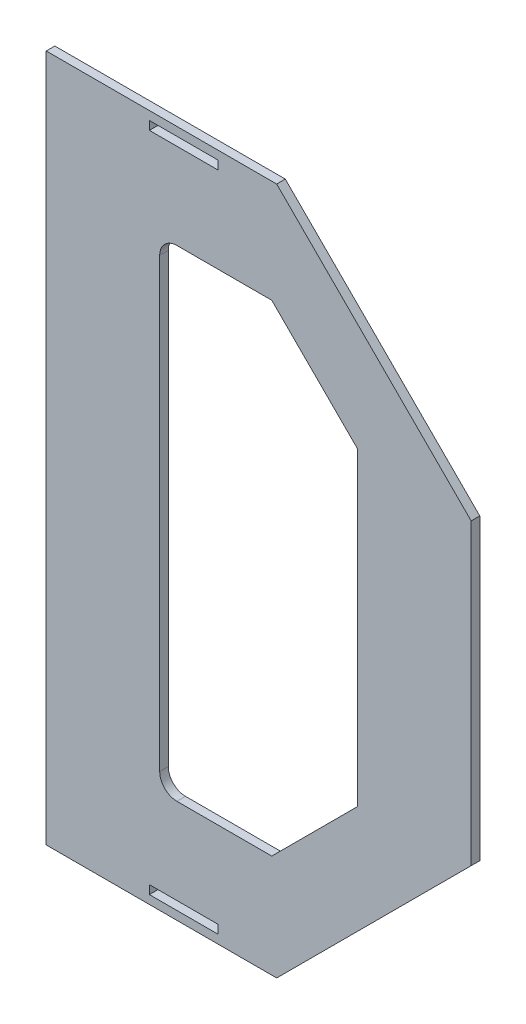
ISO-10303-21;
HEADER;
FILE_DESCRIPTION(('STEP AP214'),'2;1');
FILE_NAME('part.step','',(''),(''),'','','');
FILE_SCHEMA(('AUTOMOTIVE_DESIGN { 1 0 10303 214 1 1 1 1 }'));
ENDSEC;
DATA;
#1=APPLICATION_CONTEXT('core data for automotive mechanical design processes');
#2=APPLICATION_PROTOCOL_DEFINITION('international standard','automotive_design',2000,#1);
#3=PRODUCT_CONTEXT('',#1,'mechanical');
#4=PRODUCT('Part','Part','',(#3));
#5=PRODUCT_RELATED_PRODUCT_CATEGORY('part','',(#4));
#6=PRODUCT_DEFINITION_FORMATION('','',#4);
#7=PRODUCT_DEFINITION_CONTEXT('part definition',#1,'design');
#8=PRODUCT_DEFINITION('design','',#6,#7);
#9=PRODUCT_DEFINITION_SHAPE('','',#8);
#10=(LENGTH_UNIT() NAMED_UNIT(*) SI_UNIT(.MILLI.,.METRE.));
#11=(NAMED_UNIT(*) PLANE_ANGLE_UNIT() SI_UNIT($,.RADIAN.));
#12=(NAMED_UNIT(*) SI_UNIT($,.STERADIAN.) SOLID_ANGLE_UNIT());
#13=UNCERTAINTY_MEASURE_WITH_UNIT(LENGTH_MEASURE(1.E-05),#10,'distance_accuracy_value','');
#14=(GEOMETRIC_REPRESENTATION_CONTEXT(3) GLOBAL_UNCERTAINTY_ASSIGNED_CONTEXT((#13)) GLOBAL_UNIT_ASSIGNED_CONTEXT((#10,
#11,#12)) REPRESENTATION_CONTEXT('',''));
#15=CARTESIAN_POINT('',(0.,0.,0.));
#16=DIRECTION('',(0.,0.,1.));
#17=DIRECTION('',(1.,0.,0.));
#18=AXIS2_PLACEMENT_3D('',#15,#16,#17);
#19=CARTESIAN_POINT('',(0.,0.,-1.5875));
#20=DIRECTION('',(0.,0.,1.));
#21=DIRECTION('',(1.,0.,0.));
#22=AXIS2_PLACEMENT_3D('',#19,#20,#21);
#23=PLANE('',#22);
#24=DIRECTION('',(0.,-1.,0.));
#25=VECTOR('',#24,1.);
#26=CARTESIAN_POINT('',(-36.576,-82.55,-1.5875));
#27=LINE('',#26,#25);
#28=CARTESIAN_POINT('',(-36.576,82.55,-1.5875));
#29=VERTEX_POINT('',#28);
#30=CARTESIAN_POINT('',(-36.576,-82.55,-1.5875));
#31=VERTEX_POINT('',#30);
#32=EDGE_CURVE('E211',#29,#31,#27,.T.);
#33=ORIENTED_EDGE('',*,*,#32,.T.);
#34=CARTESIAN_POINT('',(-30.226,-82.55,-1.5875));
#35=DIRECTION('',(0.,0.,1.));
#36=DIRECTION('',(-1.,0.,0.));
#37=AXIS2_PLACEMENT_3D('',#34,#35,#36);
#38=CIRCLE('',#37,6.34999999999997);
#39=CARTESIAN_POINT('',(-30.226,-88.9,-1.5875));
#40=VERTEX_POINT('',#39);
#41=EDGE_CURVE('E205',#31,#40,#38,.T.);
#42=ORIENTED_EDGE('',*,*,#41,.T.);
#43=DIRECTION('',(1.,0.,0.));
#44=VECTOR('',#43,1.);
#45=CARTESIAN_POINT('',(-30.226,-88.9,-1.5875));
#46=LINE('',#45,#44);
#47=CARTESIAN_POINT('',(4.82599999999996,-88.9,-1.5875));
#48=VERTEX_POINT('',#47);
#49=EDGE_CURVE('E214',#40,#48,#46,.T.);
#50=ORIENTED_EDGE('',*,*,#49,.T.);
#51=DIRECTION('',(0.707106781186548,0.707106781186547,0.));
#52=VECTOR('',#51,1.);
#53=CARTESIAN_POINT('',(4.82599999999996,-88.9,-1.5875));
#54=LINE('',#53,#52);
#55=CARTESIAN_POINT('',(36.576,-57.15,-1.5875));
#56=VERTEX_POINT('',#55);
#57=EDGE_CURVE('E52',#48,#56,#54,.T.);
#58=ORIENTED_EDGE('',*,*,#57,.T.);
#59=DIRECTION('',(0.,1.,0.));
#60=VECTOR('',#59,1.);
#61=CARTESIAN_POINT('',(36.576,-57.15,-1.5875));
#62=LINE('',#61,#60);
#63=CARTESIAN_POINT('',(36.576,57.15,-1.5875));
#64=VERTEX_POINT('',#63);
#65=EDGE_CURVE('E228',#56,#64,#62,.T.);
#66=ORIENTED_EDGE('',*,*,#65,.T.);
#67=DIRECTION('',(-0.707106781186548,0.707106781186547,0.));
#68=VECTOR('',#67,1.);
#69=CARTESIAN_POINT('',(4.82599999999994,88.9,-1.5875));
#70=LINE('',#69,#68);
#71=CARTESIAN_POINT('',(4.82599999999994,88.9,-1.5875));
#72=VERTEX_POINT('',#71);
#73=EDGE_CURVE('E231',#64,#72,#70,.T.);
#74=ORIENTED_EDGE('',*,*,#73,.T.);
#75=DIRECTION('',(-1.,0.,0.));
#76=VECTOR('',#75,1.);
#77=CARTESIAN_POINT('',(-30.226,88.8999999999999,-1.5875));
#78=LINE('',#77,#76);
#79=CARTESIAN_POINT('',(-30.226,88.8999999999999,-1.5875));
#80=VERTEX_POINT('',#79);
#81=EDGE_CURVE('E234',#72,#80,#78,.T.);
#82=ORIENTED_EDGE('',*,*,#81,.T.);
#83=CARTESIAN_POINT('',(-30.226,82.55,-1.5875));
#84=DIRECTION('',(0.,0.,1.));
#85=DIRECTION('',(-1.,0.,0.));
#86=AXIS2_PLACEMENT_3D('',#83,#84,#85);
#87=CIRCLE('',#86,6.34999999999997);
#88=EDGE_CURVE('E237',#80,#29,#87,.T.);
#89=ORIENTED_EDGE('',*,*,#88,.T.);
#90=EDGE_LOOP('',(#33,#42,#50,#58,#66,#74,#82,#89));
#91=FACE_BOUND('',#90,.T.);
#92=DIRECTION('',(1.,0.,0.));
#93=VECTOR('',#92,1.);
#94=CARTESIAN_POINT('',(-40.386,-123.825,-1.5875));
#95=LINE('',#94,#93);
#96=CARTESIAN_POINT('',(-40.386,-123.825,-1.5875));
#97=VERTEX_POINT('',#96);
#98=CARTESIAN_POINT('',(-14.986,-123.825,-1.5875));
#99=VERTEX_POINT('',#98);
#100=EDGE_CURVE('E259',#97,#99,#95,.T.);
#101=ORIENTED_EDGE('',*,*,#100,.T.);
#102=DIRECTION('',(0.,1.,0.));
#103=VECTOR('',#102,1.);
#104=CARTESIAN_POINT('',(-14.986,-123.825,-1.5875));
#105=LINE('',#104,#103);
#106=CARTESIAN_POINT('',(-14.986,-120.65,-1.5875));
#107=VERTEX_POINT('',#106);
#108=EDGE_CURVE('E284',#99,#107,#105,.T.);
#109=ORIENTED_EDGE('',*,*,#108,.T.);
#110=DIRECTION('',(-1.,0.,0.));
#111=VECTOR('',#110,1.);
#112=CARTESIAN_POINT('',(-40.386,-120.65,-1.5875));
#113=LINE('',#112,#111);
#114=CARTESIAN_POINT('',(-40.386,-120.65,-1.5875));
#115=VERTEX_POINT('',#114);
#116=EDGE_CURVE('E287',#107,#115,#113,.T.);
#117=ORIENTED_EDGE('',*,*,#116,.T.);
#118=DIRECTION('',(0.,-1.,0.));
#119=VECTOR('',#118,1.);
#120=CARTESIAN_POINT('',(-40.386,-123.825,-1.5875));
#121=LINE('',#120,#119);
#122=EDGE_CURVE('E274',#115,#97,#121,.T.);
#123=ORIENTED_EDGE('',*,*,#122,.T.);
#124=EDGE_LOOP('',(#101,#109,#117,#123));
#125=FACE_BOUND('',#124,.T.);
#126=DIRECTION('',(0.,1.,0.));
#127=VECTOR('',#126,1.);
#128=CARTESIAN_POINT('',(-14.986,123.825,-1.5875));
#129=LINE('',#128,#127);
#130=CARTESIAN_POINT('',(-14.986,120.65,-1.5875));
#131=VERTEX_POINT('',#130);
#132=CARTESIAN_POINT('',(-14.986,123.825,-1.5875));
#133=VERTEX_POINT('',#132);
#134=EDGE_CURVE('E301',#131,#133,#129,.T.);
#135=ORIENTED_EDGE('',*,*,#134,.T.);
#136=DIRECTION('',(-1.,0.,0.));
#137=VECTOR('',#136,1.);
#138=CARTESIAN_POINT('',(-40.386,123.825,-1.5875));
#139=LINE('',#138,#137);
#140=CARTESIAN_POINT('',(-40.386,123.825,-1.5875));
#141=VERTEX_POINT('',#140);
#142=EDGE_CURVE('E315',#133,#141,#139,.T.);
#143=ORIENTED_EDGE('',*,*,#142,.T.);
#144=DIRECTION('',(0.,-1.,0.));
#145=VECTOR('',#144,1.);
#146=CARTESIAN_POINT('',(-40.386,123.825,-1.5875));
#147=LINE('',#146,#145);
#148=CARTESIAN_POINT('',(-40.386,120.65,-1.5875));
#149=VERTEX_POINT('',#148);
#150=EDGE_CURVE('E318',#141,#149,#147,.T.);
#151=ORIENTED_EDGE('',*,*,#150,.T.);
#152=DIRECTION('',(1.,0.,0.));
#153=VECTOR('',#152,1.);
#154=CARTESIAN_POINT('',(-40.386,120.65,-1.5875));
#155=LINE('',#154,#153);
#156=EDGE_CURVE('E305',#149,#131,#155,.T.);
#157=ORIENTED_EDGE('',*,*,#156,.T.);
#158=EDGE_LOOP('',(#135,#143,#151,#157));
#159=FACE_BOUND('',#158,.T.);
#160=DIRECTION('',(0.,-1.,0.));
#161=VECTOR('',#160,1.);
#162=CARTESIAN_POINT('',(-51.816,0.,-1.5875));
#163=LINE('',#162,#161);
#164=CARTESIAN_POINT('',(-51.816,127.,-1.5875));
#165=VERTEX_POINT('',#164);
#166=CARTESIAN_POINT('',(-51.816,-127.,-1.5875));
#167=VERTEX_POINT('',#166);
#168=EDGE_CURVE('E11',#165,#167,#163,.T.);
#169=ORIENTED_EDGE('',*,*,#168,.F.);
#170=DIRECTION('',(-1.,0.,0.));
#171=VECTOR('',#170,1.);
#172=CARTESIAN_POINT('',(-78.486,127.,-1.5875));
#173=LINE('',#172,#171);
#174=CARTESIAN_POINT('',(6.64395103144692,127.,-1.5875));
#175=VERTEX_POINT('',#174);
#176=EDGE_CURVE('E337',#175,#165,#173,.T.);
#177=ORIENTED_EDGE('',*,*,#176,.F.);
#178=DIRECTION('',(-0.707106781186546,0.707106781186549,0.));
#179=VECTOR('',#178,1.);
#180=CARTESIAN_POINT('',(6.64395103144692,127.,-1.5875));
#181=LINE('',#180,#179);
#182=CARTESIAN_POINT('',(65.786,67.8579510314466,-1.5875));
#183=VERTEX_POINT('',#182);
#184=EDGE_CURVE('E361',#183,#175,#181,.T.);
#185=ORIENTED_EDGE('',*,*,#184,.F.);
#186=DIRECTION('',(0.,1.,0.));
#187=VECTOR('',#186,1.);
#188=CARTESIAN_POINT('',(65.786,0.,-1.5875));
#189=LINE('',#188,#187);
#190=CARTESIAN_POINT('',(65.786,-67.8579510314466,-1.5875));
#191=VERTEX_POINT('',#190);
#192=EDGE_CURVE('E386',#191,#183,#189,.T.);
#193=ORIENTED_EDGE('',*,*,#192,.F.);
#194=DIRECTION('',(0.707106781186546,0.707106781186549,0.));
#195=VECTOR('',#194,1.);
#196=CARTESIAN_POINT('',(6.64395103144692,-127.,-1.5875));
#197=LINE('',#196,#195);
#198=CARTESIAN_POINT('',(6.64395103144692,-127.,-1.5875));
#199=VERTEX_POINT('',#198);
#200=EDGE_CURVE('E356',#199,#191,#197,.T.);
#201=ORIENTED_EDGE('',*,*,#200,.F.);
#202=DIRECTION('',(1.,0.,0.));
#203=VECTOR('',#202,1.);
#204=CARTESIAN_POINT('',(-78.486,-127.,-1.5875));
#205=LINE('',#204,#203);
#206=EDGE_CURVE('E350',#167,#199,#205,.T.);
#207=ORIENTED_EDGE('',*,*,#206,.F.);
#208=EDGE_LOOP('',(#169,#177,#185,#193,#201,#207));
#209=FACE_BOUND('',#208,.T.);
#210=ADVANCED_FACE('F36',(#91,#125,#159,#209),#23,.F.);
#211=CARTESIAN_POINT('',(-64.516,127.,-1.5875));
#212=VERTEX_POINT('',#211);
#213=EDGE_CURVE('E368',#165,#212,#173,.T.);
#214=ORIENTED_EDGE('',*,*,#213,.F.);
#215=ORIENTED_EDGE('',*,*,#168,.T.);
#216=CARTESIAN_POINT('',(-64.516,-127.,-1.5875));
#217=VERTEX_POINT('',#216);
#218=EDGE_CURVE('E355',#217,#167,#205,.T.);
#219=ORIENTED_EDGE('',*,*,#218,.F.);
#220=DIRECTION('',(0.,-1.,0.));
#221=VECTOR('',#220,1.);
#222=CARTESIAN_POINT('',(-64.516,0.,-1.5875));
#223=LINE('',#222,#221);
#224=EDGE_CURVE('E45',#212,#217,#223,.T.);
#225=ORIENTED_EDGE('',*,*,#224,.F.);
#226=EDGE_LOOP('',(#214,#215,#219,#225));
#227=FACE_BOUND('',#226,.T.);
#228=ADVANCED_FACE('F400',(#227),#23,.F.);
#229=CARTESIAN_POINT('',(-78.486,127.,-1.5875));
#230=VERTEX_POINT('',#229);
#231=EDGE_CURVE('E365',#212,#230,#173,.T.);
#232=ORIENTED_EDGE('',*,*,#231,.F.);
#233=ORIENTED_EDGE('',*,*,#224,.T.);
#234=CARTESIAN_POINT('',(-78.486,-127.,-1.5875));
#235=VERTEX_POINT('',#234);
#236=EDGE_CURVE('E351',#235,#217,#205,.T.);
#237=ORIENTED_EDGE('',*,*,#236,.F.);
#238=DIRECTION('',(0.,-1.,0.));
#239=VECTOR('',#238,1.);
#240=CARTESIAN_POINT('',(-78.486,127.,-1.5875));
#241=LINE('',#240,#239);
#242=EDGE_CURVE('E332',#230,#235,#241,.T.);
#243=ORIENTED_EDGE('',*,*,#242,.F.);
#244=EDGE_LOOP('',(#232,#233,#237,#243));
#245=FACE_BOUND('',#244,.T.);
#246=ADVANCED_FACE('F395',(#245),#23,.F.);
#247=CARTESIAN_POINT('',(0.,0.,1.5875));
#248=DIRECTION('',(0.,0.,1.));
#249=DIRECTION('',(1.,0.,0.));
#250=AXIS2_PLACEMENT_3D('',#247,#248,#249);
#251=PLANE('',#250);
#252=CARTESIAN_POINT('',(-30.226,-82.55,1.5875));
#253=DIRECTION('',(0.,0.,1.));
#254=DIRECTION('',(-1.,0.,0.));
#255=AXIS2_PLACEMENT_3D('',#252,#253,#254);
#256=CIRCLE('',#255,6.34999999999997);
#257=CARTESIAN_POINT('',(-36.576,-82.55,1.5875));
#258=VERTEX_POINT('',#257);
#259=CARTESIAN_POINT('',(-30.226,-88.9,1.5875));
#260=VERTEX_POINT('',#259);
#261=EDGE_CURVE('E60',#258,#260,#256,.T.);
#262=ORIENTED_EDGE('',*,*,#261,.F.);
#263=DIRECTION('',(0.,-1.,0.));
#264=VECTOR('',#263,1.);
#265=CARTESIAN_POINT('',(-36.576,-82.55,1.5875));
#266=LINE('',#265,#264);
#267=CARTESIAN_POINT('',(-36.576,82.55,1.5875));
#268=VERTEX_POINT('',#267);
#269=EDGE_CURVE('E221',#268,#258,#266,.T.);
#270=ORIENTED_EDGE('',*,*,#269,.F.);
#271=CARTESIAN_POINT('',(-30.226,82.55,1.5875));
#272=DIRECTION('',(0.,0.,1.));
#273=DIRECTION('',(-1.,0.,0.));
#274=AXIS2_PLACEMENT_3D('',#271,#272,#273);
#275=CIRCLE('',#274,6.34999999999997);
#276=CARTESIAN_POINT('',(-30.226,88.8999999999999,1.5875));
#277=VERTEX_POINT('',#276);
#278=EDGE_CURVE('E224',#277,#268,#275,.T.);
#279=ORIENTED_EDGE('',*,*,#278,.F.);
#280=DIRECTION('',(-1.,0.,0.));
#281=VECTOR('',#280,1.);
#282=CARTESIAN_POINT('',(-30.226,88.8999999999999,1.5875));
#283=LINE('',#282,#281);
#284=CARTESIAN_POINT('',(4.82599999999994,88.9,1.5875));
#285=VERTEX_POINT('',#284);
#286=EDGE_CURVE('E252',#285,#277,#283,.T.);
#287=ORIENTED_EDGE('',*,*,#286,.F.);
#288=DIRECTION('',(-0.707106781186548,0.707106781186547,0.));
#289=VECTOR('',#288,1.);
#290=CARTESIAN_POINT('',(4.82599999999994,88.9,1.5875));
#291=LINE('',#290,#289);
#292=CARTESIAN_POINT('',(36.576,57.15,1.5875));
#293=VERTEX_POINT('',#292);
#294=EDGE_CURVE('E249',#293,#285,#291,.T.);
#295=ORIENTED_EDGE('',*,*,#294,.F.);
#296=DIRECTION('',(0.,1.,0.));
#297=VECTOR('',#296,1.);
#298=CARTESIAN_POINT('',(36.576,-57.15,1.5875));
#299=LINE('',#298,#297);
#300=CARTESIAN_POINT('',(36.576,-57.15,1.5875));
#301=VERTEX_POINT('',#300);
#302=EDGE_CURVE('E246',#301,#293,#299,.T.);
#303=ORIENTED_EDGE('',*,*,#302,.F.);
#304=DIRECTION('',(0.707106781186548,0.707106781186547,0.));
#305=VECTOR('',#304,1.);
#306=CARTESIAN_POINT('',(4.82599999999996,-88.9,1.5875));
#307=LINE('',#306,#305);
#308=CARTESIAN_POINT('',(4.82599999999996,-88.9,1.5875));
#309=VERTEX_POINT('',#308);
#310=EDGE_CURVE('E243',#309,#301,#307,.T.);
#311=ORIENTED_EDGE('',*,*,#310,.F.);
#312=DIRECTION('',(1.,0.,0.));
#313=VECTOR('',#312,1.);
#314=CARTESIAN_POINT('',(-30.226,-88.9,1.5875));
#315=LINE('',#314,#313);
#316=EDGE_CURVE('E241',#260,#309,#315,.T.);
#317=ORIENTED_EDGE('',*,*,#316,.F.);
#318=EDGE_LOOP('',(#262,#270,#279,#287,#295,#303,#311,#317));
#319=FACE_BOUND('',#318,.T.);
#320=DIRECTION('',(-1.,0.,0.));
#321=VECTOR('',#320,1.);
#322=CARTESIAN_POINT('',(-40.386,123.825,1.5875));
#323=LINE('',#322,#321);
#324=CARTESIAN_POINT('',(-14.986,123.825,1.5875));
#325=VERTEX_POINT('',#324);
#326=CARTESIAN_POINT('',(-40.386,123.825,1.5875));
#327=VERTEX_POINT('',#326);
#328=EDGE_CURVE('E304',#325,#327,#323,.T.);
#329=ORIENTED_EDGE('',*,*,#328,.F.);
#330=DIRECTION('',(0.,1.,0.));
#331=VECTOR('',#330,1.);
#332=CARTESIAN_POINT('',(-14.986,123.825,1.5875));
#333=LINE('',#332,#331);
#334=CARTESIAN_POINT('',(-14.986,120.65,1.5875));
#335=VERTEX_POINT('',#334);
#336=EDGE_CURVE('E302',#335,#325,#333,.T.);
#337=ORIENTED_EDGE('',*,*,#336,.F.);
#338=DIRECTION('',(1.,0.,0.));
#339=VECTOR('',#338,1.);
#340=CARTESIAN_POINT('',(-40.386,120.65,1.5875));
#341=LINE('',#340,#339);
#342=CARTESIAN_POINT('',(-40.386,120.65,1.5875));
#343=VERTEX_POINT('',#342);
#344=EDGE_CURVE('E310',#343,#335,#341,.T.);
#345=ORIENTED_EDGE('',*,*,#344,.F.);
#346=DIRECTION('',(0.,-1.,0.));
#347=VECTOR('',#346,1.);
#348=CARTESIAN_POINT('',(-40.386,123.825,1.5875));
#349=LINE('',#348,#347);
#350=EDGE_CURVE('E307',#327,#343,#349,.T.);
#351=ORIENTED_EDGE('',*,*,#350,.F.);
#352=EDGE_LOOP('',(#329,#337,#345,#351));
#353=FACE_BOUND('',#352,.T.);
#354=DIRECTION('',(0.,-1.,0.));
#355=VECTOR('',#354,1.);
#356=CARTESIAN_POINT('',(-78.486,127.,1.5875));
#357=LINE('',#356,#355);
#358=CARTESIAN_POINT('',(-78.486,127.,1.5875));
#359=VERTEX_POINT('',#358);
#360=CARTESIAN_POINT('',(-78.486,-127.,1.5875));
#361=VERTEX_POINT('',#360);
#362=EDGE_CURVE('E333',#359,#361,#357,.T.);
#363=ORIENTED_EDGE('',*,*,#362,.T.);
#364=DIRECTION('',(1.,0.,0.));
#365=VECTOR('',#364,1.);
#366=CARTESIAN_POINT('',(-78.486,-127.,1.5875));
#367=LINE('',#366,#365);
#368=CARTESIAN_POINT('',(6.64395103144692,-127.,1.5875));
#369=VERTEX_POINT('',#368);
#370=EDGE_CURVE('E336',#361,#369,#367,.T.);
#371=ORIENTED_EDGE('',*,*,#370,.T.);
#372=DIRECTION('',(0.707106781186546,0.707106781186549,0.));
#373=VECTOR('',#372,1.);
#374=CARTESIAN_POINT('',(6.64395103144692,-127.,1.5875));
#375=LINE('',#374,#373);
#376=CARTESIAN_POINT('',(78.486,-55.1579510314466,1.5875));
#377=VERTEX_POINT('',#376);
#378=EDGE_CURVE('E339',#369,#377,#375,.T.);
#379=ORIENTED_EDGE('',*,*,#378,.T.);
#380=DIRECTION('',(0.,1.,0.));
#381=VECTOR('',#380,1.);
#382=CARTESIAN_POINT('',(78.486,-55.1579510314466,1.5875));
#383=LINE('',#382,#381);
#384=CARTESIAN_POINT('',(78.486,55.1579510314466,1.5875));
#385=VERTEX_POINT('',#384);
#386=EDGE_CURVE('E341',#377,#385,#383,.T.);
#387=ORIENTED_EDGE('',*,*,#386,.T.);
#388=DIRECTION('',(-0.707106781186546,0.707106781186549,0.));
#389=VECTOR('',#388,1.);
#390=CARTESIAN_POINT('',(6.64395103144692,127.,1.5875));
#391=LINE('',#390,#389);
#392=CARTESIAN_POINT('',(6.64395103144692,127.,1.5875));
#393=VERTEX_POINT('',#392);
#394=EDGE_CURVE('E343',#385,#393,#391,.T.);
#395=ORIENTED_EDGE('',*,*,#394,.T.);
#396=DIRECTION('',(-1.,0.,0.));
#397=VECTOR('',#396,1.);
#398=CARTESIAN_POINT('',(-78.486,127.,1.5875));
#399=LINE('',#398,#397);
#400=EDGE_CURVE('E345',#393,#359,#399,.T.);
#401=ORIENTED_EDGE('',*,*,#400,.T.);
#402=EDGE_LOOP('',(#363,#371,#379,#387,#395,#401));
#403=FACE_BOUND('',#402,.T.);
#404=DIRECTION('',(0.,1.,0.));
#405=VECTOR('',#404,1.);
#406=CARTESIAN_POINT('',(-14.986,-123.825,1.5875));
#407=LINE('',#406,#405);
#408=CARTESIAN_POINT('',(-14.986,-123.825,1.5875));
#409=VERTEX_POINT('',#408);
#410=CARTESIAN_POINT('',(-14.986,-120.65,1.5875));
#411=VERTEX_POINT('',#410);
#412=EDGE_CURVE('E273',#409,#411,#407,.T.);
#413=ORIENTED_EDGE('',*,*,#412,.F.);
#414=DIRECTION('',(1.,0.,0.));
#415=VECTOR('',#414,1.);
#416=CARTESIAN_POINT('',(-40.386,-123.825,1.5875));
#417=LINE('',#416,#415);
#418=CARTESIAN_POINT('',(-40.386,-123.825,1.5875));
#419=VERTEX_POINT('',#418);
#420=EDGE_CURVE('E271',#419,#409,#417,.T.);
#421=ORIENTED_EDGE('',*,*,#420,.F.);
#422=DIRECTION('',(0.,-1.,0.));
#423=VECTOR('',#422,1.);
#424=CARTESIAN_POINT('',(-40.386,-123.825,1.5875));
#425=LINE('',#424,#423);
#426=CARTESIAN_POINT('',(-40.386,-120.65,1.5875));
#427=VERTEX_POINT('',#426);
#428=EDGE_CURVE('E279',#427,#419,#425,.T.);
#429=ORIENTED_EDGE('',*,*,#428,.F.);
#430=DIRECTION('',(-1.,0.,0.));
#431=VECTOR('',#430,1.);
#432=CARTESIAN_POINT('',(-40.386,-120.65,1.5875));
#433=LINE('',#432,#431);
#434=EDGE_CURVE('E276',#411,#427,#433,.T.);
#435=ORIENTED_EDGE('',*,*,#434,.F.);
#436=EDGE_LOOP('',(#413,#421,#429,#435));
#437=FACE_BOUND('',#436,.T.);
#438=ADVANCED_FACE('F423',(#319,#353,#403,#437),#251,.T.);
#439=CARTESIAN_POINT('',(78.486,-55.1579510314466,-1.5875));
#440=VERTEX_POINT('',#439);
#441=EDGE_CURVE('E354',#191,#440,#197,.T.);
#442=ORIENTED_EDGE('',*,*,#441,.F.);
#443=ORIENTED_EDGE('',*,*,#192,.T.);
#444=CARTESIAN_POINT('',(78.486,55.1579510314466,-1.5875));
#445=VERTEX_POINT('',#444);
#446=EDGE_CURVE('E362',#445,#183,#181,.T.);
#447=ORIENTED_EDGE('',*,*,#446,.F.);
#448=DIRECTION('',(0.,1.,0.));
#449=VECTOR('',#448,1.);
#450=CARTESIAN_POINT('',(78.486,-55.1579510314466,-1.5875));
#451=LINE('',#450,#449);
#452=EDGE_CURVE('E359',#440,#445,#451,.T.);
#453=ORIENTED_EDGE('',*,*,#452,.F.);
#454=EDGE_LOOP('',(#442,#443,#447,#453));
#455=FACE_BOUND('',#454,.T.);
#456=ADVANCED_FACE('F433',(#455),#23,.F.);
#457=CARTESIAN_POINT('',(-78.486,127.,1.5875));
#458=DIRECTION('',(1.,0.,0.));
#459=DIRECTION('',(0.,0.,-1.));
#460=AXIS2_PLACEMENT_3D('',#457,#458,#459);
#461=PLANE('',#460);
#462=ORIENTED_EDGE('',*,*,#242,.T.);
#463=DIRECTION('',(0.,0.,-1.));
#464=VECTOR('',#463,1.);
#465=CARTESIAN_POINT('',(-78.486,-127.,1.5875));
#466=LINE('',#465,#464);
#467=EDGE_CURVE('E383',#361,#235,#466,.T.);
#468=ORIENTED_EDGE('',*,*,#467,.F.);
#469=ORIENTED_EDGE('',*,*,#362,.F.);
#470=DIRECTION('',(0.,0.,-1.));
#471=VECTOR('',#470,1.);
#472=CARTESIAN_POINT('',(-78.486,127.,1.5875));
#473=LINE('',#472,#471);
#474=EDGE_CURVE('E347',#359,#230,#473,.T.);
#475=ORIENTED_EDGE('',*,*,#474,.T.);
#476=EDGE_LOOP('',(#462,#468,#469,#475));
#477=FACE_BOUND('',#476,.T.);
#478=ADVANCED_FACE('F38',(#477),#461,.F.);
#479=CARTESIAN_POINT('',(-78.486,-127.,1.5875));
#480=DIRECTION('',(0.,1.,0.));
#481=DIRECTION('',(0.,0.,1.));
#482=AXIS2_PLACEMENT_3D('',#479,#480,#481);
#483=PLANE('',#482);
#484=ORIENTED_EDGE('',*,*,#236,.T.);
#485=ORIENTED_EDGE('',*,*,#218,.T.);
#486=ORIENTED_EDGE('',*,*,#206,.T.);
#487=DIRECTION('',(0.,0.,-1.));
#488=VECTOR('',#487,1.);
#489=CARTESIAN_POINT('',(6.64395103144692,-127.,1.5875));
#490=LINE('',#489,#488);
#491=EDGE_CURVE('E380',#369,#199,#490,.T.);
#492=ORIENTED_EDGE('',*,*,#491,.F.);
#493=ORIENTED_EDGE('',*,*,#370,.F.);
#494=ORIENTED_EDGE('',*,*,#467,.T.);
#495=EDGE_LOOP('',(#484,#485,#486,#492,#493,#494));
#496=FACE_BOUND('',#495,.T.);
#497=ADVANCED_FACE('F403',(#496),#483,.F.);
#498=CARTESIAN_POINT('',(6.64395103144692,-127.,1.5875));
#499=DIRECTION('',(-0.707106781186549,0.707106781186546,0.));
#500=DIRECTION('',(-0.707106781186546,-0.707106781186549,0.));
#501=AXIS2_PLACEMENT_3D('',#498,#499,#500);
#502=PLANE('',#501);
#503=ORIENTED_EDGE('',*,*,#200,.T.);
#504=ORIENTED_EDGE('',*,*,#441,.T.);
#505=DIRECTION('',(0.,0.,-1.));
#506=VECTOR('',#505,1.);
#507=CARTESIAN_POINT('',(78.486,-55.1579510314466,1.5875));
#508=LINE('',#507,#506);
#509=EDGE_CURVE('E377',#377,#440,#508,.T.);
#510=ORIENTED_EDGE('',*,*,#509,.F.);
#511=ORIENTED_EDGE('',*,*,#378,.F.);
#512=ORIENTED_EDGE('',*,*,#491,.T.);
#513=EDGE_LOOP('',(#503,#504,#510,#511,#512));
#514=FACE_BOUND('',#513,.T.);
#515=ADVANCED_FACE('F419',(#514),#502,.F.);
#516=CARTESIAN_POINT('',(78.486,-55.1579510314466,1.5875));
#517=DIRECTION('',(-1.,0.,0.));
#518=DIRECTION('',(0.,0.,1.));
#519=AXIS2_PLACEMENT_3D('',#516,#517,#518);
#520=PLANE('',#519);
#521=ORIENTED_EDGE('',*,*,#452,.T.);
#522=DIRECTION('',(0.,0.,-1.));
#523=VECTOR('',#522,1.);
#524=CARTESIAN_POINT('',(78.486,55.1579510314466,1.5875));
#525=LINE('',#524,#523);
#526=EDGE_CURVE('E374',#385,#445,#525,.T.);
#527=ORIENTED_EDGE('',*,*,#526,.F.);
#528=ORIENTED_EDGE('',*,*,#386,.F.);
#529=ORIENTED_EDGE('',*,*,#509,.T.);
#530=EDGE_LOOP('',(#521,#527,#528,#529));
#531=FACE_BOUND('',#530,.T.);
#532=ADVANCED_FACE('F435',(#531),#520,.F.);
#533=CARTESIAN_POINT('',(6.64395103144692,127.,1.5875));
#534=DIRECTION('',(-0.707106781186549,-0.707106781186546,0.));
#535=DIRECTION('',(0.707106781186546,-0.707106781186549,0.));
#536=AXIS2_PLACEMENT_3D('',#533,#534,#535);
#537=PLANE('',#536);
#538=ORIENTED_EDGE('',*,*,#446,.T.);
#539=ORIENTED_EDGE('',*,*,#184,.T.);
#540=DIRECTION('',(0.,0.,-1.));
#541=VECTOR('',#540,1.);
#542=CARTESIAN_POINT('',(6.64395103144692,127.,1.5875));
#543=LINE('',#542,#541);
#544=EDGE_CURVE('E371',#393,#175,#543,.T.);
#545=ORIENTED_EDGE('',*,*,#544,.F.);
#546=ORIENTED_EDGE('',*,*,#394,.F.);
#547=ORIENTED_EDGE('',*,*,#526,.T.);
#548=EDGE_LOOP('',(#538,#539,#545,#546,#547));
#549=FACE_BOUND('',#548,.T.);
#550=ADVANCED_FACE('F428',(#549),#537,.F.);
#551=CARTESIAN_POINT('',(-78.486,127.,1.5875));
#552=DIRECTION('',(0.,-1.,0.));
#553=DIRECTION('',(0.,0.,-1.));
#554=AXIS2_PLACEMENT_3D('',#551,#552,#553);
#555=PLANE('',#554);
#556=ORIENTED_EDGE('',*,*,#176,.T.);
#557=ORIENTED_EDGE('',*,*,#213,.T.);
#558=ORIENTED_EDGE('',*,*,#231,.T.);
#559=ORIENTED_EDGE('',*,*,#474,.F.);
#560=ORIENTED_EDGE('',*,*,#400,.F.);
#561=ORIENTED_EDGE('',*,*,#544,.T.);
#562=EDGE_LOOP('',(#556,#557,#558,#559,#560,#561));
#563=FACE_BOUND('',#562,.T.);
#564=ADVANCED_FACE('F411',(#563),#555,.F.);
#565=CARTESIAN_POINT('',(-14.986,123.825,1.5875));
#566=DIRECTION('',(-1.,0.,0.));
#567=DIRECTION('',(0.,0.,1.));
#568=AXIS2_PLACEMENT_3D('',#565,#566,#567);
#569=PLANE('',#568);
#570=ORIENTED_EDGE('',*,*,#134,.F.);
#571=DIRECTION('',(0.,0.,-1.));
#572=VECTOR('',#571,1.);
#573=CARTESIAN_POINT('',(-14.986,120.65,1.5875));
#574=LINE('',#573,#572);
#575=EDGE_CURVE('E312',#335,#131,#574,.T.);
#576=ORIENTED_EDGE('',*,*,#575,.F.);
#577=ORIENTED_EDGE('',*,*,#336,.T.);
#578=DIRECTION('',(0.,0.,-1.));
#579=VECTOR('',#578,1.);
#580=CARTESIAN_POINT('',(-14.986,123.825,1.5875));
#581=LINE('',#580,#579);
#582=EDGE_CURVE('E329',#325,#133,#581,.T.);
#583=ORIENTED_EDGE('',*,*,#582,.T.);
#584=EDGE_LOOP('',(#570,#576,#577,#583));
#585=FACE_BOUND('',#584,.T.);
#586=ADVANCED_FACE('F578',(#585),#569,.T.);
#587=CARTESIAN_POINT('',(-40.386,123.825,1.5875));
#588=DIRECTION('',(0.,-1.,0.));
#589=DIRECTION('',(0.,0.,-1.));
#590=AXIS2_PLACEMENT_3D('',#587,#588,#589);
#591=PLANE('',#590);
#592=ORIENTED_EDGE('',*,*,#142,.F.);
#593=ORIENTED_EDGE('',*,*,#582,.F.);
#594=ORIENTED_EDGE('',*,*,#328,.T.);
#595=DIRECTION('',(0.,0.,-1.));
#596=VECTOR('',#595,1.);
#597=CARTESIAN_POINT('',(-40.386,123.825,1.5875));
#598=LINE('',#597,#596);
#599=EDGE_CURVE('E327',#327,#141,#598,.T.);
#600=ORIENTED_EDGE('',*,*,#599,.T.);
#601=EDGE_LOOP('',(#592,#593,#594,#600));
#602=FACE_BOUND('',#601,.T.);
#603=ADVANCED_FACE('F574',(#602),#591,.T.);
#604=CARTESIAN_POINT('',(-40.386,123.825,1.5875));
#605=DIRECTION('',(1.,0.,0.));
#606=DIRECTION('',(0.,0.,-1.));
#607=AXIS2_PLACEMENT_3D('',#604,#605,#606);
#608=PLANE('',#607);
#609=ORIENTED_EDGE('',*,*,#150,.F.);
#610=ORIENTED_EDGE('',*,*,#599,.F.);
#611=ORIENTED_EDGE('',*,*,#350,.T.);
#612=DIRECTION('',(0.,0.,-1.));
#613=VECTOR('',#612,1.);
#614=CARTESIAN_POINT('',(-40.386,120.65,1.5875));
#615=LINE('',#614,#613);
#616=EDGE_CURVE('E325',#343,#149,#615,.T.);
#617=ORIENTED_EDGE('',*,*,#616,.T.);
#618=EDGE_LOOP('',(#609,#610,#611,#617));
#619=FACE_BOUND('',#618,.T.);
#620=ADVANCED_FACE('F570',(#619),#608,.T.);
#621=CARTESIAN_POINT('',(-40.386,120.65,1.5875));
#622=DIRECTION('',(0.,1.,0.));
#623=DIRECTION('',(0.,0.,1.));
#624=AXIS2_PLACEMENT_3D('',#621,#622,#623);
#625=PLANE('',#624);
#626=ORIENTED_EDGE('',*,*,#156,.F.);
#627=ORIENTED_EDGE('',*,*,#616,.F.);
#628=ORIENTED_EDGE('',*,*,#344,.T.);
#629=ORIENTED_EDGE('',*,*,#575,.T.);
#630=EDGE_LOOP('',(#626,#627,#628,#629));
#631=FACE_BOUND('',#630,.T.);
#632=ADVANCED_FACE('F566',(#631),#625,.T.);
#633=CARTESIAN_POINT('',(-40.386,-123.825,1.5875));
#634=DIRECTION('',(0.,1.,0.));
#635=DIRECTION('',(0.,0.,1.));
#636=AXIS2_PLACEMENT_3D('',#633,#634,#635);
#637=PLANE('',#636);
#638=ORIENTED_EDGE('',*,*,#100,.F.);
#639=DIRECTION('',(0.,0.,-1.));
#640=VECTOR('',#639,1.);
#641=CARTESIAN_POINT('',(-40.386,-123.825,1.5875));
#642=LINE('',#641,#640);
#643=EDGE_CURVE('E281',#419,#97,#642,.T.);
#644=ORIENTED_EDGE('',*,*,#643,.F.);
#645=ORIENTED_EDGE('',*,*,#420,.T.);
#646=DIRECTION('',(0.,0.,-1.));
#647=VECTOR('',#646,1.);
#648=CARTESIAN_POINT('',(-14.986,-123.825,1.5875));
#649=LINE('',#648,#647);
#650=EDGE_CURVE('E298',#409,#99,#649,.T.);
#651=ORIENTED_EDGE('',*,*,#650,.T.);
#652=EDGE_LOOP('',(#638,#644,#645,#651));
#653=FACE_BOUND('',#652,.T.);
#654=ADVANCED_FACE('F562',(#653),#637,.T.);
#655=CARTESIAN_POINT('',(-14.986,-123.825,1.5875));
#656=DIRECTION('',(-1.,0.,0.));
#657=DIRECTION('',(0.,0.,1.));
#658=AXIS2_PLACEMENT_3D('',#655,#656,#657);
#659=PLANE('',#658);
#660=ORIENTED_EDGE('',*,*,#108,.F.);
#661=ORIENTED_EDGE('',*,*,#650,.F.);
#662=ORIENTED_EDGE('',*,*,#412,.T.);
#663=DIRECTION('',(0.,0.,-1.));
#664=VECTOR('',#663,1.);
#665=CARTESIAN_POINT('',(-14.986,-120.65,1.5875));
#666=LINE('',#665,#664);
#667=EDGE_CURVE('E296',#411,#107,#666,.T.);
#668=ORIENTED_EDGE('',*,*,#667,.T.);
#669=EDGE_LOOP('',(#660,#661,#662,#668));
#670=FACE_BOUND('',#669,.T.);
#671=ADVANCED_FACE('F558',(#670),#659,.T.);
#672=CARTESIAN_POINT('',(-40.386,-120.65,1.5875));
#673=DIRECTION('',(0.,-1.,0.));
#674=DIRECTION('',(0.,0.,-1.));
#675=AXIS2_PLACEMENT_3D('',#672,#673,#674);
#676=PLANE('',#675);
#677=ORIENTED_EDGE('',*,*,#116,.F.);
#678=ORIENTED_EDGE('',*,*,#667,.F.);
#679=ORIENTED_EDGE('',*,*,#434,.T.);
#680=DIRECTION('',(0.,0.,-1.));
#681=VECTOR('',#680,1.);
#682=CARTESIAN_POINT('',(-40.386,-120.65,1.5875));
#683=LINE('',#682,#681);
#684=EDGE_CURVE('E294',#427,#115,#683,.T.);
#685=ORIENTED_EDGE('',*,*,#684,.T.);
#686=EDGE_LOOP('',(#677,#678,#679,#685));
#687=FACE_BOUND('',#686,.T.);
#688=ADVANCED_FACE('F554',(#687),#676,.T.);
#689=CARTESIAN_POINT('',(-40.386,-123.825,1.5875));
#690=DIRECTION('',(1.,0.,0.));
#691=DIRECTION('',(0.,0.,-1.));
#692=AXIS2_PLACEMENT_3D('',#689,#690,#691);
#693=PLANE('',#692);
#694=ORIENTED_EDGE('',*,*,#122,.F.);
#695=ORIENTED_EDGE('',*,*,#684,.F.);
#696=ORIENTED_EDGE('',*,*,#428,.T.);
#697=ORIENTED_EDGE('',*,*,#643,.T.);
#698=EDGE_LOOP('',(#694,#695,#696,#697));
#699=FACE_BOUND('',#698,.T.);
#700=ADVANCED_FACE('F480',(#699),#693,.T.);
#701=CARTESIAN_POINT('',(-30.226,-82.55,-1.5875));
#702=DIRECTION('',(0.,0.,1.));
#703=DIRECTION('',(1.,0.,0.));
#704=AXIS2_PLACEMENT_3D('',#701,#702,#703);
#705=CYLINDRICAL_SURFACE('',#704,6.34999999999997);
#706=ORIENTED_EDGE('',*,*,#261,.T.);
#707=DIRECTION('',(0.,0.,1.));
#708=VECTOR('',#707,1.);
#709=CARTESIAN_POINT('',(-30.226,-88.9,-1.5875));
#710=LINE('',#709,#708);
#711=EDGE_CURVE('E201',#40,#260,#710,.T.);
#712=ORIENTED_EDGE('',*,*,#711,.F.);
#713=ORIENTED_EDGE('',*,*,#41,.F.);
#714=DIRECTION('',(0.,0.,1.));
#715=VECTOR('',#714,1.);
#716=CARTESIAN_POINT('',(-36.576,-82.55,-1.5875));
#717=LINE('',#716,#715);
#718=EDGE_CURVE('E257',#31,#258,#717,.T.);
#719=ORIENTED_EDGE('',*,*,#718,.T.);
#720=EDGE_LOOP('',(#706,#712,#713,#719));
#721=FACE_BOUND('',#720,.T.);
#722=ADVANCED_FACE('F203',(#721),#705,.F.);
#723=CARTESIAN_POINT('',(-36.576,-82.55,-1.5875));
#724=DIRECTION('',(-1.,0.,0.));
#725=DIRECTION('',(0.,-1.,0.));
#726=AXIS2_PLACEMENT_3D('',#723,#724,#725);
#727=PLANE('',#726);
#728=ORIENTED_EDGE('',*,*,#269,.T.);
#729=ORIENTED_EDGE('',*,*,#718,.F.);
#730=ORIENTED_EDGE('',*,*,#32,.F.);
#731=DIRECTION('',(0.,0.,1.));
#732=VECTOR('',#731,1.);
#733=CARTESIAN_POINT('',(-36.576,82.55,-1.5875));
#734=LINE('',#733,#732);
#735=EDGE_CURVE('E260',#29,#268,#734,.T.);
#736=ORIENTED_EDGE('',*,*,#735,.T.);
#737=EDGE_LOOP('',(#728,#729,#730,#736));
#738=FACE_BOUND('',#737,.T.);
#739=ADVANCED_FACE('F479',(#738),#727,.F.);
#740=CARTESIAN_POINT('',(-30.226,82.55,-1.5875));
#741=DIRECTION('',(0.,0.,1.));
#742=DIRECTION('',(1.,0.,0.));
#743=AXIS2_PLACEMENT_3D('',#740,#741,#742);
#744=CYLINDRICAL_SURFACE('',#743,6.34999999999997);
#745=ORIENTED_EDGE('',*,*,#278,.T.);
#746=ORIENTED_EDGE('',*,*,#735,.F.);
#747=ORIENTED_EDGE('',*,*,#88,.F.);
#748=DIRECTION('',(0.,0.,1.));
#749=VECTOR('',#748,1.);
#750=CARTESIAN_POINT('',(-30.226,88.8999999999999,-1.5875));
#751=LINE('',#750,#749);
#752=EDGE_CURVE('E262',#80,#277,#751,.T.);
#753=ORIENTED_EDGE('',*,*,#752,.T.);
#754=EDGE_LOOP('',(#745,#746,#747,#753));
#755=FACE_BOUND('',#754,.T.);
#756=ADVANCED_FACE('F491',(#755),#744,.F.);
#757=CARTESIAN_POINT('',(-30.226,88.8999999999999,-1.5875));
#758=DIRECTION('',(0.,1.,0.));
#759=DIRECTION('',(-1.,0.,0.));
#760=AXIS2_PLACEMENT_3D('',#757,#758,#759);
#761=PLANE('',#760);
#762=ORIENTED_EDGE('',*,*,#286,.T.);
#763=ORIENTED_EDGE('',*,*,#752,.F.);
#764=ORIENTED_EDGE('',*,*,#81,.F.);
#765=DIRECTION('',(0.,0.,1.));
#766=VECTOR('',#765,1.);
#767=CARTESIAN_POINT('',(4.82599999999994,88.9,-1.5875));
#768=LINE('',#767,#766);
#769=EDGE_CURVE('E264',#72,#285,#768,.T.);
#770=ORIENTED_EDGE('',*,*,#769,.T.);
#771=EDGE_LOOP('',(#762,#763,#764,#770));
#772=FACE_BOUND('',#771,.T.);
#773=ADVANCED_FACE('F501',(#772),#761,.F.);
#774=CARTESIAN_POINT('',(4.82599999999994,88.9,-1.5875));
#775=DIRECTION('',(0.707106781186547,0.707106781186548,0.));
#776=DIRECTION('',(-0.707106781186548,0.707106781186547,0.));
#777=AXIS2_PLACEMENT_3D('',#774,#775,#776);
#778=PLANE('',#777);
#779=ORIENTED_EDGE('',*,*,#294,.T.);
#780=ORIENTED_EDGE('',*,*,#769,.F.);
#781=ORIENTED_EDGE('',*,*,#73,.F.);
#782=DIRECTION('',(0.,0.,1.));
#783=VECTOR('',#782,1.);
#784=CARTESIAN_POINT('',(36.576,57.15,-1.5875));
#785=LINE('',#784,#783);
#786=EDGE_CURVE('E266',#64,#293,#785,.T.);
#787=ORIENTED_EDGE('',*,*,#786,.T.);
#788=EDGE_LOOP('',(#779,#780,#781,#787));
#789=FACE_BOUND('',#788,.T.);
#790=ADVANCED_FACE('F511',(#789),#778,.F.);
#791=CARTESIAN_POINT('',(36.576,-57.15,-1.5875));
#792=DIRECTION('',(1.,0.,0.));
#793=DIRECTION('',(0.,1.,0.));
#794=AXIS2_PLACEMENT_3D('',#791,#792,#793);
#795=PLANE('',#794);
#796=ORIENTED_EDGE('',*,*,#302,.T.);
#797=ORIENTED_EDGE('',*,*,#786,.F.);
#798=ORIENTED_EDGE('',*,*,#65,.F.);
#799=DIRECTION('',(0.,0.,1.));
#800=VECTOR('',#799,1.);
#801=CARTESIAN_POINT('',(36.576,-57.15,-1.5875));
#802=LINE('',#801,#800);
#803=EDGE_CURVE('E268',#56,#301,#802,.T.);
#804=ORIENTED_EDGE('',*,*,#803,.T.);
#805=EDGE_LOOP('',(#796,#797,#798,#804));
#806=FACE_BOUND('',#805,.T.);
#807=ADVANCED_FACE('F521',(#806),#795,.F.);
#808=CARTESIAN_POINT('',(4.82599999999996,-88.9,-1.5875));
#809=DIRECTION('',(0.707106781186547,-0.707106781186548,0.));
#810=DIRECTION('',(0.707106781186548,0.707106781186547,0.));
#811=AXIS2_PLACEMENT_3D('',#808,#809,#810);
#812=PLANE('',#811);
#813=ORIENTED_EDGE('',*,*,#310,.T.);
#814=ORIENTED_EDGE('',*,*,#803,.F.);
#815=ORIENTED_EDGE('',*,*,#57,.F.);
#816=DIRECTION('',(0.,0.,1.));
#817=VECTOR('',#816,1.);
#818=CARTESIAN_POINT('',(4.82599999999996,-88.9,-1.5875));
#819=LINE('',#818,#817);
#820=EDGE_CURVE('E210',#48,#309,#819,.T.);
#821=ORIENTED_EDGE('',*,*,#820,.T.);
#822=EDGE_LOOP('',(#813,#814,#815,#821));
#823=FACE_BOUND('',#822,.T.);
#824=ADVANCED_FACE('F531',(#823),#812,.F.);
#825=CARTESIAN_POINT('',(-30.226,-88.9,-1.5875));
#826=DIRECTION('',(0.,-1.,0.));
#827=DIRECTION('',(1.,0.,0.));
#828=AXIS2_PLACEMENT_3D('',#825,#826,#827);
#829=PLANE('',#828);
#830=ORIENTED_EDGE('',*,*,#316,.T.);
#831=ORIENTED_EDGE('',*,*,#820,.F.);
#832=ORIENTED_EDGE('',*,*,#49,.F.);
#833=ORIENTED_EDGE('',*,*,#711,.T.);
#834=EDGE_LOOP('',(#830,#831,#832,#833));
#835=FACE_BOUND('',#834,.T.);
#836=ADVANCED_FACE('F215',(#835),#829,.F.);
#837=CLOSED_SHELL('',(#210,#228,#246,#438,#456,#478,#497,#515,#532,#550,#564,#586,#603,#620,
#632,#654,#671,#688,#700,#722,#739,#756,#773,#790,#807,#824,#836));
#838=MANIFOLD_SOLID_BREP('B2',#837);
#839=ADVANCED_BREP_SHAPE_REPRESENTATION('',(#18,#838),#14);
#840=SHAPE_DEFINITION_REPRESENTATION(#9,#839);
ENDSEC;
END-ISO-10303-21;
